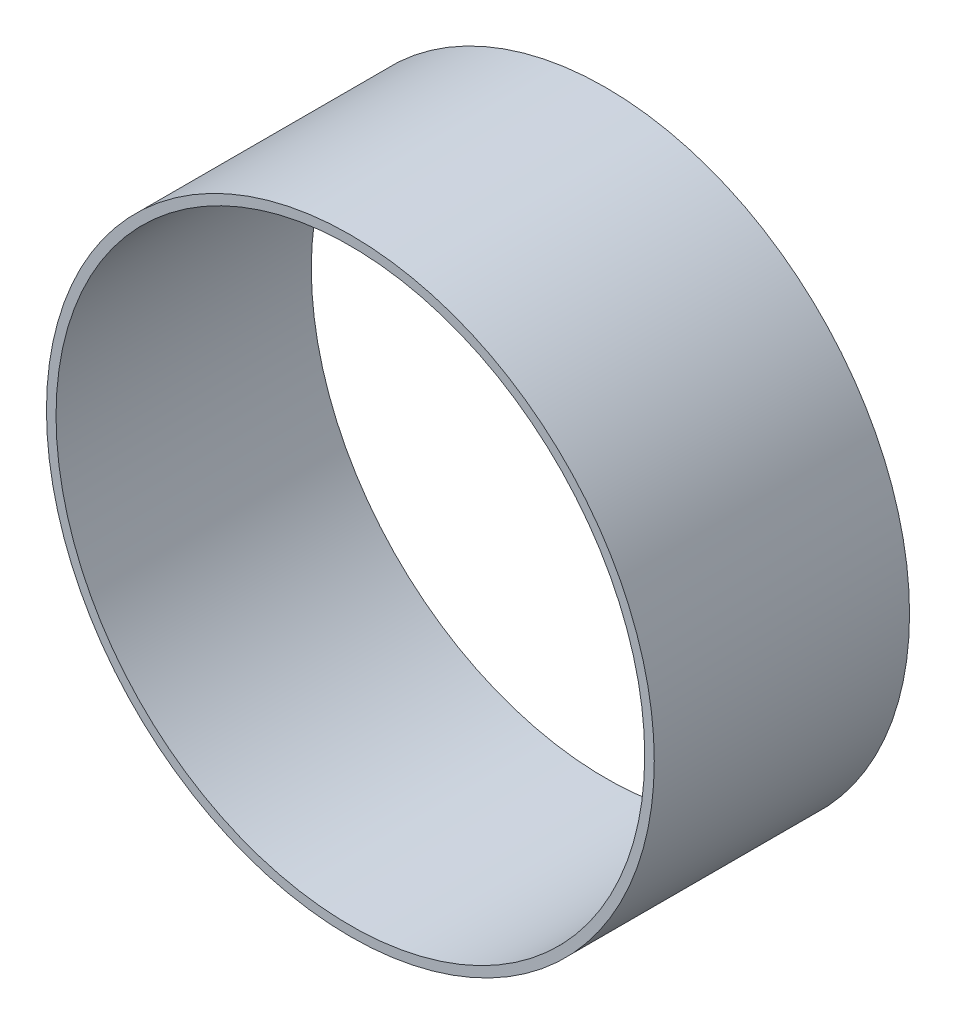
ISO-10303-21;
HEADER;
FILE_DESCRIPTION(('STEP AP214'),'2;1');
FILE_NAME('part.step','',(''),(''),'','','');
FILE_SCHEMA(('AUTOMOTIVE_DESIGN { 1 0 10303 214 1 1 1 1 }'));
ENDSEC;
DATA;
#1=APPLICATION_CONTEXT('core data for automotive mechanical design processes');
#2=APPLICATION_PROTOCOL_DEFINITION('international standard','automotive_design',2000,#1);
#3=PRODUCT_CONTEXT('',#1,'mechanical');
#4=PRODUCT('Part','Part','',(#3));
#5=PRODUCT_RELATED_PRODUCT_CATEGORY('part','',(#4));
#6=PRODUCT_DEFINITION_FORMATION('','',#4);
#7=PRODUCT_DEFINITION_CONTEXT('part definition',#1,'design');
#8=PRODUCT_DEFINITION('design','',#6,#7);
#9=PRODUCT_DEFINITION_SHAPE('','',#8);
#10=(LENGTH_UNIT() NAMED_UNIT(*) SI_UNIT(.MILLI.,.METRE.));
#11=(NAMED_UNIT(*) PLANE_ANGLE_UNIT() SI_UNIT($,.RADIAN.));
#12=(NAMED_UNIT(*) SI_UNIT($,.STERADIAN.) SOLID_ANGLE_UNIT());
#13=UNCERTAINTY_MEASURE_WITH_UNIT(LENGTH_MEASURE(1.E-05),#10,'distance_accuracy_value','');
#14=(GEOMETRIC_REPRESENTATION_CONTEXT(3) GLOBAL_UNCERTAINTY_ASSIGNED_CONTEXT((#13)) GLOBAL_UNIT_ASSIGNED_CONTEXT((#10,
#11,#12)) REPRESENTATION_CONTEXT('',''));
#15=CARTESIAN_POINT('',(0.,0.,0.));
#16=DIRECTION('',(0.,0.,1.));
#17=DIRECTION('',(1.,0.,0.));
#18=AXIS2_PLACEMENT_3D('',#15,#16,#17);
#19=CARTESIAN_POINT('',(0.,0.,40.));
#20=DIRECTION('',(0.,0.,1.));
#21=DIRECTION('',(1.,0.,0.));
#22=AXIS2_PLACEMENT_3D('',#19,#20,#21);
#23=PLANE('',#22);
#24=CARTESIAN_POINT('',(0.,0.,40.));
#25=DIRECTION('',(0.,0.,1.));
#26=DIRECTION('',(1.,0.,0.));
#27=AXIS2_PLACEMENT_3D('',#24,#25,#26);
#28=CIRCLE('',#27,95.2461538461538);
#29=CARTESIAN_POINT('',(95.2461538461538,0.,40.));
#30=VERTEX_POINT('',#29);
#31=EDGE_CURVE('E10',#30,#30,#28,.T.);
#32=ORIENTED_EDGE('',*,*,#31,.T.);
#33=EDGE_LOOP('',(#32));
#34=FACE_BOUND('',#33,.T.);
#35=CARTESIAN_POINT('',(0.,0.,40.));
#36=DIRECTION('',(0.,0.,1.));
#37=DIRECTION('',(1.,0.,0.));
#38=AXIS2_PLACEMENT_3D('',#35,#36,#37);
#39=CIRCLE('',#38,92.2461538461538);
#40=CARTESIAN_POINT('',(92.2461538461538,0.,40.));
#41=VERTEX_POINT('',#40);
#42=EDGE_CURVE('E46',#41,#41,#39,.T.);
#43=ORIENTED_EDGE('',*,*,#42,.F.);
#44=EDGE_LOOP('',(#43));
#45=FACE_BOUND('',#44,.T.);
#46=ADVANCED_FACE('F35',(#34,#45),#23,.T.);
#47=CARTESIAN_POINT('',(0.,0.,-40.));
#48=DIRECTION('',(0.,0.,1.));
#49=DIRECTION('',(1.,0.,0.));
#50=AXIS2_PLACEMENT_3D('',#47,#48,#49);
#51=PLANE('',#50);
#52=CARTESIAN_POINT('',(0.,0.,-40.));
#53=DIRECTION('',(0.,0.,1.));
#54=DIRECTION('',(1.,0.,0.));
#55=AXIS2_PLACEMENT_3D('',#52,#53,#54);
#56=CIRCLE('',#55,95.2461538461538);
#57=CARTESIAN_POINT('',(95.2461538461538,0.,-40.));
#58=VERTEX_POINT('',#57);
#59=EDGE_CURVE('E39',#58,#58,#56,.T.);
#60=ORIENTED_EDGE('',*,*,#59,.F.);
#61=EDGE_LOOP('',(#60));
#62=FACE_BOUND('',#61,.T.);
#63=CARTESIAN_POINT('',(0.,0.,-40.));
#64=DIRECTION('',(0.,0.,1.));
#65=DIRECTION('',(1.,0.,0.));
#66=AXIS2_PLACEMENT_3D('',#63,#64,#65);
#67=CIRCLE('',#66,92.2461538461538);
#68=CARTESIAN_POINT('',(92.2461538461538,0.,-40.));
#69=VERTEX_POINT('',#68);
#70=EDGE_CURVE('E48',#69,#69,#67,.T.);
#71=ORIENTED_EDGE('',*,*,#70,.T.);
#72=EDGE_LOOP('',(#71));
#73=FACE_BOUND('',#72,.T.);
#74=ADVANCED_FACE('F58',(#62,#73),#51,.F.);
#75=CARTESIAN_POINT('',(0.,0.,40.));
#76=DIRECTION('',(0.,0.,-1.));
#77=DIRECTION('',(-1.,0.,0.));
#78=AXIS2_PLACEMENT_3D('',#75,#76,#77);
#79=CYLINDRICAL_SURFACE('',#78,95.2461538461538);
#80=ORIENTED_EDGE('',*,*,#31,.F.);
#81=EDGE_LOOP('',(#80));
#82=FACE_BOUND('',#81,.T.);
#83=ORIENTED_EDGE('',*,*,#59,.T.);
#84=EDGE_LOOP('',(#83));
#85=FACE_BOUND('',#84,.T.);
#86=ADVANCED_FACE('F37',(#82,#85),#79,.T.);
#87=CARTESIAN_POINT('',(0.,0.,40.));
#88=DIRECTION('',(0.,0.,-1.));
#89=DIRECTION('',(-1.,0.,0.));
#90=AXIS2_PLACEMENT_3D('',#87,#88,#89);
#91=CYLINDRICAL_SURFACE('',#90,92.2461538461538);
#92=ORIENTED_EDGE('',*,*,#42,.T.);
#93=EDGE_LOOP('',(#92));
#94=FACE_BOUND('',#93,.T.);
#95=ORIENTED_EDGE('',*,*,#70,.F.);
#96=EDGE_LOOP('',(#95));
#97=FACE_BOUND('',#96,.T.);
#98=ADVANCED_FACE('F54',(#94,#97),#91,.F.);
#99=CLOSED_SHELL('',(#46,#74,#86,#98));
#100=MANIFOLD_SOLID_BREP('B2',#99);
#101=ADVANCED_BREP_SHAPE_REPRESENTATION('',(#18,#100),#14);
#102=SHAPE_DEFINITION_REPRESENTATION(#9,#101);
ENDSEC;
END-ISO-10303-21;
